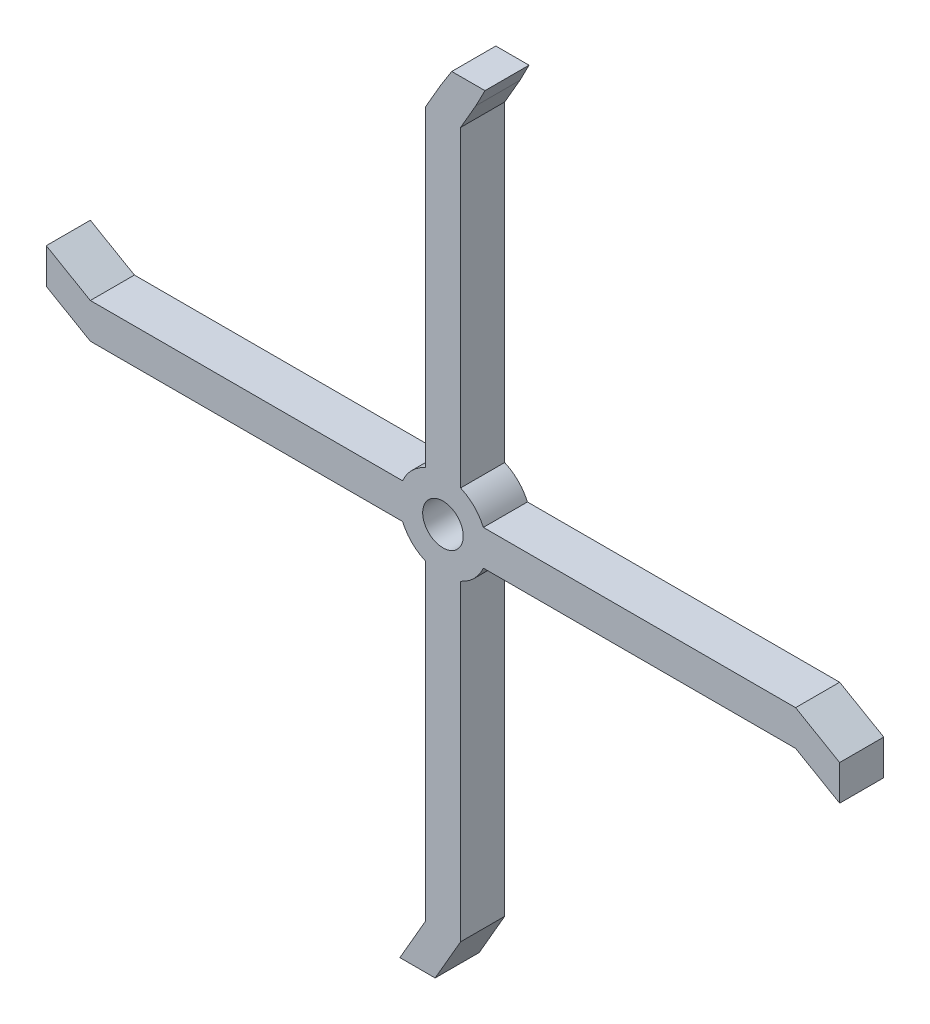
ISO-10303-21;
HEADER;
FILE_DESCRIPTION(('STEP AP214'),'2;1');
FILE_NAME('part.step','',(''),(''),'','','');
FILE_SCHEMA(('AUTOMOTIVE_DESIGN { 1 0 10303 214 1 1 1 1 }'));
ENDSEC;
DATA;
#1=APPLICATION_CONTEXT('core data for automotive mechanical design processes');
#2=APPLICATION_PROTOCOL_DEFINITION('international standard','automotive_design',2000,#1);
#3=PRODUCT_CONTEXT('',#1,'mechanical');
#4=PRODUCT('Part','Part','',(#3));
#5=PRODUCT_RELATED_PRODUCT_CATEGORY('part','',(#4));
#6=PRODUCT_DEFINITION_FORMATION('','',#4);
#7=PRODUCT_DEFINITION_CONTEXT('part definition',#1,'design');
#8=PRODUCT_DEFINITION('design','',#6,#7);
#9=PRODUCT_DEFINITION_SHAPE('','',#8);
#10=(LENGTH_UNIT() NAMED_UNIT(*) SI_UNIT(.MILLI.,.METRE.));
#11=(NAMED_UNIT(*) PLANE_ANGLE_UNIT() SI_UNIT($,.RADIAN.));
#12=(NAMED_UNIT(*) SI_UNIT($,.STERADIAN.) SOLID_ANGLE_UNIT());
#13=UNCERTAINTY_MEASURE_WITH_UNIT(LENGTH_MEASURE(1.E-05),#10,'distance_accuracy_value','');
#14=(GEOMETRIC_REPRESENTATION_CONTEXT(3) GLOBAL_UNCERTAINTY_ASSIGNED_CONTEXT((#13)) GLOBAL_UNIT_ASSIGNED_CONTEXT((#10,
#11,#12)) REPRESENTATION_CONTEXT('',''));
#15=CARTESIAN_POINT('',(0.,0.,0.));
#16=DIRECTION('',(0.,0.,1.));
#17=DIRECTION('',(1.,0.,0.));
#18=AXIS2_PLACEMENT_3D('',#15,#16,#17);
#19=CARTESIAN_POINT('',(0.,0.,5.));
#20=DIRECTION('',(0.,0.,-1.));
#21=DIRECTION('',(-1.,0.,0.));
#22=AXIS2_PLACEMENT_3D('',#19,#20,#21);
#23=CYLINDRICAL_SURFACE('',#22,5.);
#24=DIRECTION('',(0.,0.,-1.));
#25=VECTOR('',#24,1.);
#26=CARTESIAN_POINT('',(-2.,-4.58257569495584,5.));
#27=LINE('',#26,#25);
#28=CARTESIAN_POINT('',(-2.,-4.58257569495584,5.));
#29=VERTEX_POINT('',#28);
#30=CARTESIAN_POINT('',(-2.,-4.58257569495584,0.));
#31=VERTEX_POINT('',#30);
#32=EDGE_CURVE('E62',#29,#31,#27,.T.);
#33=ORIENTED_EDGE('',*,*,#32,.F.);
#34=CARTESIAN_POINT('',(0.,0.,5.));
#35=DIRECTION('',(0.,0.,1.));
#36=DIRECTION('',(1.,0.,0.));
#37=AXIS2_PLACEMENT_3D('',#34,#35,#36);
#38=CIRCLE('',#37,5.);
#39=CARTESIAN_POINT('',(-4.58257569495584,-2.,5.));
#40=VERTEX_POINT('',#39);
#41=EDGE_CURVE('E47',#40,#29,#38,.T.);
#42=ORIENTED_EDGE('',*,*,#41,.F.);
#43=DIRECTION('',(0.,0.,-1.));
#44=VECTOR('',#43,1.);
#45=CARTESIAN_POINT('',(-4.58257569495584,-2.,5.));
#46=LINE('',#45,#44);
#47=CARTESIAN_POINT('',(-4.58257569495584,-2.,0.));
#48=VERTEX_POINT('',#47);
#49=EDGE_CURVE('E298',#40,#48,#46,.T.);
#50=ORIENTED_EDGE('',*,*,#49,.T.);
#51=CARTESIAN_POINT('',(0.,0.,0.));
#52=DIRECTION('',(0.,0.,1.));
#53=DIRECTION('',(1.,0.,0.));
#54=AXIS2_PLACEMENT_3D('',#51,#52,#53);
#55=CIRCLE('',#54,5.);
#56=EDGE_CURVE('E450',#48,#31,#55,.T.);
#57=ORIENTED_EDGE('',*,*,#56,.T.);
#58=EDGE_LOOP('',(#33,#42,#50,#57));
#59=FACE_BOUND('',#58,.T.);
#60=ADVANCED_FACE('F38',(#59),#23,.T.);
#61=DIRECTION('',(0.,0.,-1.));
#62=VECTOR('',#61,1.);
#63=CARTESIAN_POINT('',(2.,-4.58257569495584,5.));
#64=LINE('',#63,#62);
#65=CARTESIAN_POINT('',(2.,-4.58257569495584,5.));
#66=VERTEX_POINT('',#65);
#67=CARTESIAN_POINT('',(2.,-4.58257569495584,0.));
#68=VERTEX_POINT('',#67);
#69=EDGE_CURVE('E447',#66,#68,#64,.T.);
#70=ORIENTED_EDGE('',*,*,#69,.T.);
#71=CARTESIAN_POINT('',(4.58257569495584,-2.,0.));
#72=VERTEX_POINT('',#71);
#73=EDGE_CURVE('E445',#68,#72,#55,.T.);
#74=ORIENTED_EDGE('',*,*,#73,.T.);
#75=DIRECTION('',(0.,0.,-1.));
#76=VECTOR('',#75,1.);
#77=CARTESIAN_POINT('',(4.58257569495584,-2.,5.));
#78=LINE('',#77,#76);
#79=CARTESIAN_POINT('',(4.58257569495584,-2.,5.));
#80=VERTEX_POINT('',#79);
#81=EDGE_CURVE('E276',#80,#72,#78,.T.);
#82=ORIENTED_EDGE('',*,*,#81,.F.);
#83=EDGE_CURVE('E48',#66,#80,#38,.T.);
#84=ORIENTED_EDGE('',*,*,#83,.F.);
#85=EDGE_LOOP('',(#70,#74,#82,#84));
#86=FACE_BOUND('',#85,.T.);
#87=ADVANCED_FACE('F409',(#86),#23,.T.);
#88=DIRECTION('',(0.,0.,-1.));
#89=VECTOR('',#88,1.);
#90=CARTESIAN_POINT('',(4.58257569495584,2.,5.));
#91=LINE('',#90,#89);
#92=CARTESIAN_POINT('',(4.58257569495584,2.,5.));
#93=VERTEX_POINT('',#92);
#94=CARTESIAN_POINT('',(4.58257569495584,2.,0.));
#95=VERTEX_POINT('',#94);
#96=EDGE_CURVE('E279',#93,#95,#91,.T.);
#97=ORIENTED_EDGE('',*,*,#96,.T.);
#98=CARTESIAN_POINT('',(2.,4.58257569495584,0.));
#99=VERTEX_POINT('',#98);
#100=EDGE_CURVE('E388',#95,#99,#55,.T.);
#101=ORIENTED_EDGE('',*,*,#100,.T.);
#102=DIRECTION('',(0.,0.,-1.));
#103=VECTOR('',#102,1.);
#104=CARTESIAN_POINT('',(2.,4.58257569495584,5.));
#105=LINE('',#104,#103);
#106=CARTESIAN_POINT('',(2.,4.58257569495584,5.));
#107=VERTEX_POINT('',#106);
#108=EDGE_CURVE('E376',#107,#99,#105,.T.);
#109=ORIENTED_EDGE('',*,*,#108,.F.);
#110=EDGE_CURVE('E422',#93,#107,#38,.T.);
#111=ORIENTED_EDGE('',*,*,#110,.F.);
#112=EDGE_LOOP('',(#97,#101,#109,#111));
#113=FACE_BOUND('',#112,.T.);
#114=ADVANCED_FACE('F40',(#113),#23,.T.);
#115=CARTESIAN_POINT('',(-1.99999999999999,4.58257569495584,0.));
#116=VERTEX_POINT('',#115);
#117=CARTESIAN_POINT('',(-4.58257569495584,2.,0.));
#118=VERTEX_POINT('',#117);
#119=EDGE_CURVE('E42',#116,#118,#55,.T.);
#120=ORIENTED_EDGE('',*,*,#119,.T.);
#121=DIRECTION('',(0.,0.,-1.));
#122=VECTOR('',#121,1.);
#123=CARTESIAN_POINT('',(-4.58257569495584,2.,5.));
#124=LINE('',#123,#122);
#125=CARTESIAN_POINT('',(-4.58257569495584,2.,5.));
#126=VERTEX_POINT('',#125);
#127=EDGE_CURVE('E322',#126,#118,#124,.T.);
#128=ORIENTED_EDGE('',*,*,#127,.F.);
#129=CARTESIAN_POINT('',(-1.99999999999999,4.58257569495584,5.));
#130=VERTEX_POINT('',#129);
#131=EDGE_CURVE('E11',#130,#126,#38,.T.);
#132=ORIENTED_EDGE('',*,*,#131,.F.);
#133=DIRECTION('',(0.,0.,-1.));
#134=VECTOR('',#133,1.);
#135=CARTESIAN_POINT('',(-1.99999999999999,4.58257569495584,5.));
#136=LINE('',#135,#134);
#137=EDGE_CURVE('E379',#130,#116,#136,.T.);
#138=ORIENTED_EDGE('',*,*,#137,.T.);
#139=EDGE_LOOP('',(#120,#128,#132,#138));
#140=FACE_BOUND('',#139,.T.);
#141=ADVANCED_FACE('F413',(#140),#23,.T.);
#142=CARTESIAN_POINT('',(0.,0.,5.));
#143=DIRECTION('',(0.,0.,1.));
#144=DIRECTION('',(1.,0.,0.));
#145=AXIS2_PLACEMENT_3D('',#142,#143,#144);
#146=PLANE('',#145);
#147=ORIENTED_EDGE('',*,*,#41,.T.);
#148=DIRECTION('',(0.,-1.,0.));
#149=VECTOR('',#148,1.);
#150=CARTESIAN_POINT('',(-2.,0.,5.));
#151=LINE('',#150,#149);
#152=CARTESIAN_POINT('',(-2.,-40.,5.));
#153=VERTEX_POINT('',#152);
#154=EDGE_CURVE('E224',#29,#153,#151,.T.);
#155=ORIENTED_EDGE('',*,*,#154,.T.);
#156=DIRECTION('',(-0.499999999999995,-0.866025403784442,0.));
#157=VECTOR('',#156,1.);
#158=CARTESIAN_POINT('',(15.8205080756886,-9.13397459621535,5.));
#159=LINE('',#158,#157);
#160=CARTESIAN_POINT('',(-4.88675134594808,-45.,5.));
#161=VERTEX_POINT('',#160);
#162=EDGE_CURVE('E213',#153,#161,#159,.T.);
#163=ORIENTED_EDGE('',*,*,#162,.T.);
#164=DIRECTION('',(1.,0.,0.));
#165=VECTOR('',#164,1.);
#166=CARTESIAN_POINT('',(0.,-45.,5.));
#167=LINE('',#166,#165);
#168=CARTESIAN_POINT('',(-0.886751345948087,-45.,5.));
#169=VERTEX_POINT('',#168);
#170=EDGE_CURVE('E223',#161,#169,#167,.T.);
#171=ORIENTED_EDGE('',*,*,#170,.T.);
#172=DIRECTION('',(0.499999999999996,0.866025403784441,0.));
#173=VECTOR('',#172,1.);
#174=CARTESIAN_POINT('',(18.8205080756887,-10.8660254037843,5.));
#175=LINE('',#174,#173);
#176=CARTESIAN_POINT('',(2.,-40.,5.));
#177=VERTEX_POINT('',#176);
#178=EDGE_CURVE('E454',#169,#177,#175,.T.);
#179=ORIENTED_EDGE('',*,*,#178,.T.);
#180=DIRECTION('',(0.,1.,0.));
#181=VECTOR('',#180,1.);
#182=CARTESIAN_POINT('',(2.,0.,5.));
#183=LINE('',#182,#181);
#184=EDGE_CURVE('E452',#177,#66,#183,.T.);
#185=ORIENTED_EDGE('',*,*,#184,.T.);
#186=ORIENTED_EDGE('',*,*,#83,.T.);
#187=DIRECTION('',(1.,0.,0.));
#188=VECTOR('',#187,1.);
#189=CARTESIAN_POINT('',(0.,-2.,5.));
#190=LINE('',#189,#188);
#191=CARTESIAN_POINT('',(40.,-2.,5.));
#192=VERTEX_POINT('',#191);
#193=EDGE_CURVE('E252',#80,#192,#190,.T.);
#194=ORIENTED_EDGE('',*,*,#193,.T.);
#195=DIRECTION('',(-0.866025403784442,0.499999999999995,0.));
#196=VECTOR('',#195,1.);
#197=CARTESIAN_POINT('',(9.13397459621536,15.8205080756886,5.));
#198=LINE('',#197,#196);
#199=CARTESIAN_POINT('',(45.,-4.88675134594809,5.));
#200=VERTEX_POINT('',#199);
#201=EDGE_CURVE('E254',#200,#192,#198,.T.);
#202=ORIENTED_EDGE('',*,*,#201,.F.);
#203=DIRECTION('',(0.,-1.,0.));
#204=VECTOR('',#203,1.);
#205=CARTESIAN_POINT('',(45.,0.,5.));
#206=LINE('',#205,#204);
#207=CARTESIAN_POINT('',(45.,-0.886751345948091,5.));
#208=VERTEX_POINT('',#207);
#209=EDGE_CURVE('E257',#208,#200,#206,.T.);
#210=ORIENTED_EDGE('',*,*,#209,.F.);
#211=DIRECTION('',(0.866025403784441,-0.499999999999995,0.));
#212=VECTOR('',#211,1.);
#213=CARTESIAN_POINT('',(10.8660254037842,18.8205080756887,5.));
#214=LINE('',#213,#212);
#215=CARTESIAN_POINT('',(40.,2.,5.));
#216=VERTEX_POINT('',#215);
#217=EDGE_CURVE('E245',#216,#208,#214,.T.);
#218=ORIENTED_EDGE('',*,*,#217,.F.);
#219=DIRECTION('',(-1.,0.,0.));
#220=VECTOR('',#219,1.);
#221=CARTESIAN_POINT('',(0.,2.,5.));
#222=LINE('',#221,#220);
#223=EDGE_CURVE('E248',#216,#93,#222,.T.);
#224=ORIENTED_EDGE('',*,*,#223,.T.);
#225=ORIENTED_EDGE('',*,*,#110,.T.);
#226=DIRECTION('',(0.,1.,0.));
#227=VECTOR('',#226,1.);
#228=CARTESIAN_POINT('',(2.00000000000001,0.,5.));
#229=LINE('',#228,#227);
#230=CARTESIAN_POINT('',(1.99999999999998,40.,5.));
#231=VERTEX_POINT('',#230);
#232=EDGE_CURVE('E333',#107,#231,#229,.T.);
#233=ORIENTED_EDGE('',*,*,#232,.T.);
#234=DIRECTION('',(-0.499999999999993,-0.866025403784443,0.));
#235=VECTOR('',#234,1.);
#236=CARTESIAN_POINT('',(-15.8205080756886,9.13397459621529,5.));
#237=LINE('',#236,#235);
#238=CARTESIAN_POINT('',(3.7282679058567,42.9934478220346,5.));
#239=VERTEX_POINT('',#238);
#240=EDGE_CURVE('E335',#239,#231,#237,.T.);
#241=ORIENTED_EDGE('',*,*,#240,.F.);
#242=DIRECTION('',(-0.459096275000418,-0.888386520767138,0.));
#243=VECTOR('',#242,1.);
#244=CARTESIAN_POINT('',(-14.5926270323289,7.54111026721517,5.));
#245=LINE('',#244,#243);
#246=CARTESIAN_POINT('',(4.76520465462956,45.,5.));
#247=VERTEX_POINT('',#246);
#248=EDGE_CURVE('E338',#247,#239,#245,.T.);
#249=ORIENTED_EDGE('',*,*,#248,.F.);
#250=DIRECTION('',(1.,0.,0.));
#251=VECTOR('',#250,1.);
#252=CARTESIAN_POINT('',(0.,45.,5.));
#253=LINE('',#252,#251);
#254=CARTESIAN_POINT('',(0.996826511950873,45.,5.));
#255=VERTEX_POINT('',#254);
#256=EDGE_CURVE('E341',#255,#247,#253,.T.);
#257=ORIENTED_EDGE('',*,*,#256,.F.);
#258=DIRECTION('',(0.534373108507071,0.845248709495904,0.));
#259=VECTOR('',#258,1.);
#260=CARTESIAN_POINT('',(-19.6133400189448,12.3997130742504,5.));
#261=LINE('',#260,#259);
#262=CARTESIAN_POINT('',(-0.271732094143301,42.9934478220346,5.));
#263=VERTEX_POINT('',#262);
#264=EDGE_CURVE('E344',#263,#255,#261,.T.);
#265=ORIENTED_EDGE('',*,*,#264,.F.);
#266=DIRECTION('',(0.499999999999992,0.866025403784443,0.));
#267=VECTOR('',#266,1.);
#268=CARTESIAN_POINT('',(-18.8205080756886,10.8660254037841,5.));
#269=LINE('',#268,#267);
#270=CARTESIAN_POINT('',(-2.00000000000001,40.,5.));
#271=VERTEX_POINT('',#270);
#272=EDGE_CURVE('E326',#271,#263,#269,.T.);
#273=ORIENTED_EDGE('',*,*,#272,.F.);
#274=DIRECTION('',(0.,-1.,0.));
#275=VECTOR('',#274,1.);
#276=CARTESIAN_POINT('',(-1.99999999999999,0.,5.));
#277=LINE('',#276,#275);
#278=EDGE_CURVE('E329',#271,#130,#277,.T.);
#279=ORIENTED_EDGE('',*,*,#278,.T.);
#280=ORIENTED_EDGE('',*,*,#131,.T.);
#281=DIRECTION('',(1.,0.,0.));
#282=VECTOR('',#281,1.);
#283=CARTESIAN_POINT('',(0.,2.,5.));
#284=LINE('',#283,#282);
#285=CARTESIAN_POINT('',(-40.,2.,5.));
#286=VERTEX_POINT('',#285);
#287=EDGE_CURVE('E285',#286,#126,#284,.T.);
#288=ORIENTED_EDGE('',*,*,#287,.F.);
#289=DIRECTION('',(-0.866025403784443,0.499999999999993,0.));
#290=VECTOR('',#289,1.);
#291=CARTESIAN_POINT('',(-9.1339745962153,-15.8205080756886,5.));
#292=LINE('',#291,#290);
#293=CARTESIAN_POINT('',(-45.,4.88675134594807,5.));
#294=VERTEX_POINT('',#293);
#295=EDGE_CURVE('E288',#286,#294,#292,.T.);
#296=ORIENTED_EDGE('',*,*,#295,.T.);
#297=DIRECTION('',(0.,-1.,0.));
#298=VECTOR('',#297,1.);
#299=CARTESIAN_POINT('',(-45.,0.,5.));
#300=LINE('',#299,#298);
#301=CARTESIAN_POINT('',(-45.,0.886751345948076,5.));
#302=VERTEX_POINT('',#301);
#303=EDGE_CURVE('E291',#294,#302,#300,.T.);
#304=ORIENTED_EDGE('',*,*,#303,.T.);
#305=DIRECTION('',(0.866025403784443,-0.499999999999993,0.));
#306=VECTOR('',#305,1.);
#307=CARTESIAN_POINT('',(-10.8660254037841,-18.8205080756886,5.));
#308=LINE('',#307,#306);
#309=CARTESIAN_POINT('',(-40.,-2.,5.));
#310=VERTEX_POINT('',#309);
#311=EDGE_CURVE('E293',#302,#310,#308,.T.);
#312=ORIENTED_EDGE('',*,*,#311,.T.);
#313=DIRECTION('',(-1.,0.,0.));
#314=VECTOR('',#313,1.);
#315=CARTESIAN_POINT('',(0.,-2.,5.));
#316=LINE('',#315,#314);
#317=EDGE_CURVE('E295',#40,#310,#316,.T.);
#318=ORIENTED_EDGE('',*,*,#317,.F.);
#319=EDGE_LOOP('',(#147,#155,#163,#171,#179,#185,#186,#194,#202,#210,#218,#224,#225,#233,#241,
#249,#257,#265,#273,#279,#280,#288,#296,#304,#312,#318));
#320=FACE_BOUND('',#319,.T.);
#321=CARTESIAN_POINT('',(0.,0.,5.));
#322=DIRECTION('',(0.,0.,1.));
#323=DIRECTION('',(1.,0.,0.));
#324=AXIS2_PLACEMENT_3D('',#321,#322,#323);
#325=CIRCLE('',#324,2.3);
#326=CARTESIAN_POINT('',(2.3,0.,5.));
#327=VERTEX_POINT('',#326);
#328=EDGE_CURVE('E385',#327,#327,#325,.T.);
#329=ORIENTED_EDGE('',*,*,#328,.F.);
#330=EDGE_LOOP('',(#329));
#331=FACE_BOUND('',#330,.T.);
#332=ADVANCED_FACE('F227',(#320,#331),#146,.T.);
#333=CARTESIAN_POINT('',(0.,0.,0.));
#334=DIRECTION('',(0.,0.,1.));
#335=DIRECTION('',(1.,0.,0.));
#336=AXIS2_PLACEMENT_3D('',#333,#334,#335);
#337=PLANE('',#336);
#338=ORIENTED_EDGE('',*,*,#73,.F.);
#339=DIRECTION('',(0.,1.,0.));
#340=VECTOR('',#339,1.);
#341=CARTESIAN_POINT('',(2.,0.,0.));
#342=LINE('',#341,#340);
#343=CARTESIAN_POINT('',(2.,-40.,0.));
#344=VERTEX_POINT('',#343);
#345=EDGE_CURVE('E231',#344,#68,#342,.T.);
#346=ORIENTED_EDGE('',*,*,#345,.F.);
#347=DIRECTION('',(0.499999999999996,0.866025403784441,0.));
#348=VECTOR('',#347,1.);
#349=CARTESIAN_POINT('',(18.8205080756887,-10.8660254037843,0.));
#350=LINE('',#349,#348);
#351=CARTESIAN_POINT('',(-0.886751345948087,-45.,0.));
#352=VERTEX_POINT('',#351);
#353=EDGE_CURVE('E470',#352,#344,#350,.T.);
#354=ORIENTED_EDGE('',*,*,#353,.F.);
#355=DIRECTION('',(1.,0.,0.));
#356=VECTOR('',#355,1.);
#357=CARTESIAN_POINT('',(0.,-45.,0.));
#358=LINE('',#357,#356);
#359=CARTESIAN_POINT('',(-4.88675134594808,-45.,0.));
#360=VERTEX_POINT('',#359);
#361=EDGE_CURVE('E473',#360,#352,#358,.T.);
#362=ORIENTED_EDGE('',*,*,#361,.F.);
#363=DIRECTION('',(-0.499999999999995,-0.866025403784442,0.));
#364=VECTOR('',#363,1.);
#365=CARTESIAN_POINT('',(15.8205080756886,-9.13397459621535,0.));
#366=LINE('',#365,#364);
#367=CARTESIAN_POINT('',(-2.,-40.,0.));
#368=VERTEX_POINT('',#367);
#369=EDGE_CURVE('E475',#368,#360,#366,.T.);
#370=ORIENTED_EDGE('',*,*,#369,.F.);
#371=DIRECTION('',(0.,-1.,0.));
#372=VECTOR('',#371,1.);
#373=CARTESIAN_POINT('',(-2.,0.,0.));
#374=LINE('',#373,#372);
#375=EDGE_CURVE('E235',#31,#368,#374,.T.);
#376=ORIENTED_EDGE('',*,*,#375,.F.);
#377=ORIENTED_EDGE('',*,*,#56,.F.);
#378=DIRECTION('',(-1.,0.,0.));
#379=VECTOR('',#378,1.);
#380=CARTESIAN_POINT('',(0.,-2.,0.));
#381=LINE('',#380,#379);
#382=CARTESIAN_POINT('',(-40.,-2.,0.));
#383=VERTEX_POINT('',#382);
#384=EDGE_CURVE('E289',#48,#383,#381,.T.);
#385=ORIENTED_EDGE('',*,*,#384,.T.);
#386=DIRECTION('',(0.866025403784443,-0.499999999999993,0.));
#387=VECTOR('',#386,1.);
#388=CARTESIAN_POINT('',(-10.8660254037841,-18.8205080756886,0.));
#389=LINE('',#388,#387);
#390=CARTESIAN_POINT('',(-45.,0.886751345948076,0.));
#391=VERTEX_POINT('',#390);
#392=EDGE_CURVE('E305',#391,#383,#389,.T.);
#393=ORIENTED_EDGE('',*,*,#392,.F.);
#394=DIRECTION('',(0.,-1.,0.));
#395=VECTOR('',#394,1.);
#396=CARTESIAN_POINT('',(-45.,0.,0.));
#397=LINE('',#396,#395);
#398=CARTESIAN_POINT('',(-45.,4.88675134594807,0.));
#399=VERTEX_POINT('',#398);
#400=EDGE_CURVE('E303',#399,#391,#397,.T.);
#401=ORIENTED_EDGE('',*,*,#400,.F.);
#402=DIRECTION('',(-0.866025403784443,0.499999999999993,0.));
#403=VECTOR('',#402,1.);
#404=CARTESIAN_POINT('',(-9.1339745962153,-15.8205080756886,0.));
#405=LINE('',#404,#403);
#406=CARTESIAN_POINT('',(-40.,2.,0.));
#407=VERTEX_POINT('',#406);
#408=EDGE_CURVE('E301',#407,#399,#405,.T.);
#409=ORIENTED_EDGE('',*,*,#408,.F.);
#410=DIRECTION('',(1.,0.,0.));
#411=VECTOR('',#410,1.);
#412=CARTESIAN_POINT('',(0.,2.,0.));
#413=LINE('',#412,#411);
#414=EDGE_CURVE('E284',#407,#118,#413,.T.);
#415=ORIENTED_EDGE('',*,*,#414,.T.);
#416=ORIENTED_EDGE('',*,*,#119,.F.);
#417=DIRECTION('',(0.,-1.,0.));
#418=VECTOR('',#417,1.);
#419=CARTESIAN_POINT('',(-1.99999999999999,0.,0.));
#420=LINE('',#419,#418);
#421=CARTESIAN_POINT('',(-2.00000000000001,40.,0.));
#422=VERTEX_POINT('',#421);
#423=EDGE_CURVE('E350',#422,#116,#420,.T.);
#424=ORIENTED_EDGE('',*,*,#423,.F.);
#425=DIRECTION('',(0.499999999999992,0.866025403784443,0.));
#426=VECTOR('',#425,1.);
#427=CARTESIAN_POINT('',(-18.8205080756886,10.8660254037841,0.));
#428=LINE('',#427,#426);
#429=CARTESIAN_POINT('',(-0.271732094143301,42.9934478220346,0.));
#430=VERTEX_POINT('',#429);
#431=EDGE_CURVE('E325',#422,#430,#428,.T.);
#432=ORIENTED_EDGE('',*,*,#431,.T.);
#433=DIRECTION('',(0.534373108507071,0.845248709495904,0.));
#434=VECTOR('',#433,1.);
#435=CARTESIAN_POINT('',(-19.6133400189448,12.3997130742504,0.));
#436=LINE('',#435,#434);
#437=CARTESIAN_POINT('',(0.996826511950873,45.,0.));
#438=VERTEX_POINT('',#437);
#439=EDGE_CURVE('E330',#430,#438,#436,.T.);
#440=ORIENTED_EDGE('',*,*,#439,.T.);
#441=DIRECTION('',(1.,0.,0.));
#442=VECTOR('',#441,1.);
#443=CARTESIAN_POINT('',(0.,45.,0.));
#444=LINE('',#443,#442);
#445=CARTESIAN_POINT('',(4.76520465462956,45.,0.));
#446=VERTEX_POINT('',#445);
#447=EDGE_CURVE('E362',#438,#446,#444,.T.);
#448=ORIENTED_EDGE('',*,*,#447,.T.);
#449=DIRECTION('',(-0.459096275000418,-0.888386520767138,0.));
#450=VECTOR('',#449,1.);
#451=CARTESIAN_POINT('',(-14.5926270323289,7.54111026721517,0.));
#452=LINE('',#451,#450);
#453=CARTESIAN_POINT('',(3.7282679058567,42.9934478220346,0.));
#454=VERTEX_POINT('',#453);
#455=EDGE_CURVE('E359',#446,#454,#452,.T.);
#456=ORIENTED_EDGE('',*,*,#455,.T.);
#457=DIRECTION('',(-0.499999999999993,-0.866025403784443,0.));
#458=VECTOR('',#457,1.);
#459=CARTESIAN_POINT('',(-15.8205080756886,9.13397459621529,0.));
#460=LINE('',#459,#458);
#461=CARTESIAN_POINT('',(1.99999999999998,40.,0.));
#462=VERTEX_POINT('',#461);
#463=EDGE_CURVE('E356',#454,#462,#460,.T.);
#464=ORIENTED_EDGE('',*,*,#463,.T.);
#465=DIRECTION('',(0.,1.,0.));
#466=VECTOR('',#465,1.);
#467=CARTESIAN_POINT('',(2.00000000000001,0.,0.));
#468=LINE('',#467,#466);
#469=EDGE_CURVE('E353',#99,#462,#468,.T.);
#470=ORIENTED_EDGE('',*,*,#469,.F.);
#471=ORIENTED_EDGE('',*,*,#100,.F.);
#472=DIRECTION('',(-1.,0.,0.));
#473=VECTOR('',#472,1.);
#474=CARTESIAN_POINT('',(0.,2.,0.));
#475=LINE('',#474,#473);
#476=CARTESIAN_POINT('',(40.,2.,0.));
#477=VERTEX_POINT('',#476);
#478=EDGE_CURVE('E239',#477,#95,#475,.T.);
#479=ORIENTED_EDGE('',*,*,#478,.F.);
#480=DIRECTION('',(0.866025403784441,-0.499999999999995,0.));
#481=VECTOR('',#480,1.);
#482=CARTESIAN_POINT('',(10.8660254037842,18.8205080756887,0.));
#483=LINE('',#482,#481);
#484=CARTESIAN_POINT('',(45.,-0.886751345948091,0.));
#485=VERTEX_POINT('',#484);
#486=EDGE_CURVE('E236',#477,#485,#483,.T.);
#487=ORIENTED_EDGE('',*,*,#486,.T.);
#488=DIRECTION('',(0.,-1.,0.));
#489=VECTOR('',#488,1.);
#490=CARTESIAN_POINT('',(45.,0.,0.));
#491=LINE('',#490,#489);
#492=CARTESIAN_POINT('',(45.,-4.88675134594809,0.));
#493=VERTEX_POINT('',#492);
#494=EDGE_CURVE('E249',#485,#493,#491,.T.);
#495=ORIENTED_EDGE('',*,*,#494,.T.);
#496=DIRECTION('',(-0.866025403784442,0.499999999999995,0.));
#497=VECTOR('',#496,1.);
#498=CARTESIAN_POINT('',(9.13397459621536,15.8205080756886,0.));
#499=LINE('',#498,#497);
#500=CARTESIAN_POINT('',(40.,-2.,0.));
#501=VERTEX_POINT('',#500);
#502=EDGE_CURVE('E266',#493,#501,#499,.T.);
#503=ORIENTED_EDGE('',*,*,#502,.T.);
#504=DIRECTION('',(1.,0.,0.));
#505=VECTOR('',#504,1.);
#506=CARTESIAN_POINT('',(0.,-2.,0.));
#507=LINE('',#506,#505);
#508=EDGE_CURVE('E263',#72,#501,#507,.T.);
#509=ORIENTED_EDGE('',*,*,#508,.F.);
#510=EDGE_LOOP('',(#338,#346,#354,#362,#370,#376,#377,#385,#393,#401,#409,#415,#416,#424,#432,
#440,#448,#456,#464,#470,#471,#479,#487,#495,#503,#509));
#511=FACE_BOUND('',#510,.T.);
#512=CARTESIAN_POINT('',(0.,0.,0.));
#513=DIRECTION('',(0.,0.,1.));
#514=DIRECTION('',(1.,0.,0.));
#515=AXIS2_PLACEMENT_3D('',#512,#513,#514);
#516=CIRCLE('',#515,2.3);
#517=CARTESIAN_POINT('',(2.3,0.,0.));
#518=VERTEX_POINT('',#517);
#519=EDGE_CURVE('E384',#518,#518,#516,.T.);
#520=ORIENTED_EDGE('',*,*,#519,.T.);
#521=EDGE_LOOP('',(#520));
#522=FACE_BOUND('',#521,.T.);
#523=ADVANCED_FACE('F392',(#511,#522),#337,.F.);
#524=CARTESIAN_POINT('',(0.,0.,5.));
#525=DIRECTION('',(0.,0.,-1.));
#526=DIRECTION('',(-1.,0.,0.));
#527=AXIS2_PLACEMENT_3D('',#524,#525,#526);
#528=CYLINDRICAL_SURFACE('',#527,2.3);
#529=ORIENTED_EDGE('',*,*,#328,.T.);
#530=EDGE_LOOP('',(#529));
#531=FACE_BOUND('',#530,.T.);
#532=ORIENTED_EDGE('',*,*,#519,.F.);
#533=EDGE_LOOP('',(#532));
#534=FACE_BOUND('',#533,.T.);
#535=ADVANCED_FACE('F394',(#531,#534),#528,.F.);
#536=CARTESIAN_POINT('',(-18.8205080756886,10.8660254037841,5.));
#537=DIRECTION('',(-0.866025403784443,0.499999999999992,0.));
#538=DIRECTION('',(-0.499999999999992,-0.866025403784443,0.));
#539=AXIS2_PLACEMENT_3D('',#536,#537,#538);
#540=PLANE('',#539);
#541=ORIENTED_EDGE('',*,*,#431,.F.);
#542=DIRECTION('',(0.,0.,-1.));
#543=VECTOR('',#542,1.);
#544=CARTESIAN_POINT('',(-2.00000000000001,40.,5.));
#545=LINE('',#544,#543);
#546=EDGE_CURVE('E382',#271,#422,#545,.T.);
#547=ORIENTED_EDGE('',*,*,#546,.F.);
#548=ORIENTED_EDGE('',*,*,#272,.T.);
#549=DIRECTION('',(0.,0.,-1.));
#550=VECTOR('',#549,1.);
#551=CARTESIAN_POINT('',(-0.271732094143301,42.9934478220346,5.));
#552=LINE('',#551,#550);
#553=EDGE_CURVE('E347',#263,#430,#552,.T.);
#554=ORIENTED_EDGE('',*,*,#553,.T.);
#555=EDGE_LOOP('',(#541,#547,#548,#554));
#556=FACE_BOUND('',#555,.T.);
#557=ADVANCED_FACE('F396',(#556),#540,.T.);
#558=CARTESIAN_POINT('',(-1.99999999999999,0.,5.));
#559=DIRECTION('',(1.,0.,0.));
#560=DIRECTION('',(0.,1.,0.));
#561=AXIS2_PLACEMENT_3D('',#558,#559,#560);
#562=PLANE('',#561);
#563=ORIENTED_EDGE('',*,*,#423,.T.);
#564=ORIENTED_EDGE('',*,*,#137,.F.);
#565=ORIENTED_EDGE('',*,*,#278,.F.);
#566=ORIENTED_EDGE('',*,*,#546,.T.);
#567=EDGE_LOOP('',(#563,#564,#565,#566));
#568=FACE_BOUND('',#567,.T.);
#569=ADVANCED_FACE('F403',(#568),#562,.F.);
#570=CARTESIAN_POINT('',(2.00000000000001,0.,5.));
#571=DIRECTION('',(-1.,0.,0.));
#572=DIRECTION('',(0.,-1.,0.));
#573=AXIS2_PLACEMENT_3D('',#570,#571,#572);
#574=PLANE('',#573);
#575=ORIENTED_EDGE('',*,*,#469,.T.);
#576=DIRECTION('',(0.,0.,-1.));
#577=VECTOR('',#576,1.);
#578=CARTESIAN_POINT('',(1.99999999999998,40.,5.));
#579=LINE('',#578,#577);
#580=EDGE_CURVE('E374',#231,#462,#579,.T.);
#581=ORIENTED_EDGE('',*,*,#580,.F.);
#582=ORIENTED_EDGE('',*,*,#232,.F.);
#583=ORIENTED_EDGE('',*,*,#108,.T.);
#584=EDGE_LOOP('',(#575,#581,#582,#583));
#585=FACE_BOUND('',#584,.T.);
#586=ADVANCED_FACE('F539',(#585),#574,.F.);
#587=CARTESIAN_POINT('',(-15.8205080756886,9.13397459621529,5.));
#588=DIRECTION('',(0.866025403784443,-0.499999999999993,0.));
#589=DIRECTION('',(0.499999999999993,0.866025403784443,0.));
#590=AXIS2_PLACEMENT_3D('',#587,#588,#589);
#591=PLANE('',#590);
#592=ORIENTED_EDGE('',*,*,#463,.F.);
#593=DIRECTION('',(0.,0.,-1.));
#594=VECTOR('',#593,1.);
#595=CARTESIAN_POINT('',(3.7282679058567,42.9934478220346,5.));
#596=LINE('',#595,#594);
#597=EDGE_CURVE('E372',#239,#454,#596,.T.);
#598=ORIENTED_EDGE('',*,*,#597,.F.);
#599=ORIENTED_EDGE('',*,*,#240,.T.);
#600=ORIENTED_EDGE('',*,*,#580,.T.);
#601=EDGE_LOOP('',(#592,#598,#599,#600));
#602=FACE_BOUND('',#601,.T.);
#603=ADVANCED_FACE('F535',(#602),#591,.T.);
#604=CARTESIAN_POINT('',(-14.5926270323289,7.54111026721517,5.));
#605=DIRECTION('',(0.888386520767138,-0.459096275000418,0.));
#606=DIRECTION('',(0.459096275000418,0.888386520767138,0.));
#607=AXIS2_PLACEMENT_3D('',#604,#605,#606);
#608=PLANE('',#607);
#609=ORIENTED_EDGE('',*,*,#455,.F.);
#610=DIRECTION('',(0.,0.,-1.));
#611=VECTOR('',#610,1.);
#612=CARTESIAN_POINT('',(4.76520465462956,45.,5.));
#613=LINE('',#612,#611);
#614=EDGE_CURVE('E370',#247,#446,#613,.T.);
#615=ORIENTED_EDGE('',*,*,#614,.F.);
#616=ORIENTED_EDGE('',*,*,#248,.T.);
#617=ORIENTED_EDGE('',*,*,#597,.T.);
#618=EDGE_LOOP('',(#609,#615,#616,#617));
#619=FACE_BOUND('',#618,.T.);
#620=ADVANCED_FACE('F531',(#619),#608,.T.);
#621=CARTESIAN_POINT('',(0.,45.,5.));
#622=DIRECTION('',(0.,1.,0.));
#623=DIRECTION('',(0.,0.,1.));
#624=AXIS2_PLACEMENT_3D('',#621,#622,#623);
#625=PLANE('',#624);
#626=ORIENTED_EDGE('',*,*,#447,.F.);
#627=DIRECTION('',(0.,0.,-1.));
#628=VECTOR('',#627,1.);
#629=CARTESIAN_POINT('',(0.996826511950873,45.,5.));
#630=LINE('',#629,#628);
#631=EDGE_CURVE('E368',#255,#438,#630,.T.);
#632=ORIENTED_EDGE('',*,*,#631,.F.);
#633=ORIENTED_EDGE('',*,*,#256,.T.);
#634=ORIENTED_EDGE('',*,*,#614,.T.);
#635=EDGE_LOOP('',(#626,#632,#633,#634));
#636=FACE_BOUND('',#635,.T.);
#637=ADVANCED_FACE('F527',(#636),#625,.T.);
#638=CARTESIAN_POINT('',(-19.6133400189448,12.3997130742504,5.));
#639=DIRECTION('',(-0.845248709495904,0.534373108507071,0.));
#640=DIRECTION('',(-0.534373108507071,-0.845248709495904,0.));
#641=AXIS2_PLACEMENT_3D('',#638,#639,#640);
#642=PLANE('',#641);
#643=ORIENTED_EDGE('',*,*,#439,.F.);
#644=ORIENTED_EDGE('',*,*,#553,.F.);
#645=ORIENTED_EDGE('',*,*,#264,.T.);
#646=ORIENTED_EDGE('',*,*,#631,.T.);
#647=EDGE_LOOP('',(#643,#644,#645,#646));
#648=FACE_BOUND('',#647,.T.);
#649=ADVANCED_FACE('F523',(#648),#642,.T.);
#650=CARTESIAN_POINT('',(0.,2.,5.));
#651=DIRECTION('',(0.,1.,0.));
#652=DIRECTION('',(0.,0.,1.));
#653=AXIS2_PLACEMENT_3D('',#650,#651,#652);
#654=PLANE('',#653);
#655=ORIENTED_EDGE('',*,*,#414,.F.);
#656=DIRECTION('',(0.,0.,-1.));
#657=VECTOR('',#656,1.);
#658=CARTESIAN_POINT('',(-40.,2.,5.));
#659=LINE('',#658,#657);
#660=EDGE_CURVE('E320',#286,#407,#659,.T.);
#661=ORIENTED_EDGE('',*,*,#660,.F.);
#662=ORIENTED_EDGE('',*,*,#287,.T.);
#663=ORIENTED_EDGE('',*,*,#127,.T.);
#664=EDGE_LOOP('',(#655,#661,#662,#663));
#665=FACE_BOUND('',#664,.T.);
#666=ADVANCED_FACE('F519',(#665),#654,.T.);
#667=CARTESIAN_POINT('',(-9.1339745962153,-15.8205080756886,5.));
#668=DIRECTION('',(-0.499999999999993,-0.866025403784442,0.));
#669=DIRECTION('',(0.866025403784442,-0.499999999999993,0.));
#670=AXIS2_PLACEMENT_3D('',#667,#668,#669);
#671=PLANE('',#670);
#672=ORIENTED_EDGE('',*,*,#408,.T.);
#673=DIRECTION('',(0.,0.,-1.));
#674=VECTOR('',#673,1.);
#675=CARTESIAN_POINT('',(-45.,4.88675134594807,5.));
#676=LINE('',#675,#674);
#677=EDGE_CURVE('E317',#294,#399,#676,.T.);
#678=ORIENTED_EDGE('',*,*,#677,.F.);
#679=ORIENTED_EDGE('',*,*,#295,.F.);
#680=ORIENTED_EDGE('',*,*,#660,.T.);
#681=EDGE_LOOP('',(#672,#678,#679,#680));
#682=FACE_BOUND('',#681,.T.);
#683=ADVANCED_FACE('F515',(#682),#671,.F.);
#684=CARTESIAN_POINT('',(-45.,0.,5.));
#685=DIRECTION('',(1.,0.,0.));
#686=DIRECTION('',(0.,1.,0.));
#687=AXIS2_PLACEMENT_3D('',#684,#685,#686);
#688=PLANE('',#687);
#689=ORIENTED_EDGE('',*,*,#400,.T.);
#690=DIRECTION('',(0.,0.,-1.));
#691=VECTOR('',#690,1.);
#692=CARTESIAN_POINT('',(-45.,0.886751345948076,5.));
#693=LINE('',#692,#691);
#694=EDGE_CURVE('E314',#302,#391,#693,.T.);
#695=ORIENTED_EDGE('',*,*,#694,.F.);
#696=ORIENTED_EDGE('',*,*,#303,.F.);
#697=ORIENTED_EDGE('',*,*,#677,.T.);
#698=EDGE_LOOP('',(#689,#695,#696,#697));
#699=FACE_BOUND('',#698,.T.);
#700=ADVANCED_FACE('F511',(#699),#688,.F.);
#701=CARTESIAN_POINT('',(-10.8660254037841,-18.8205080756886,5.));
#702=DIRECTION('',(0.499999999999993,0.866025403784443,0.));
#703=DIRECTION('',(-0.866025403784443,0.499999999999993,0.));
#704=AXIS2_PLACEMENT_3D('',#701,#702,#703);
#705=PLANE('',#704);
#706=ORIENTED_EDGE('',*,*,#392,.T.);
#707=DIRECTION('',(0.,0.,-1.));
#708=VECTOR('',#707,1.);
#709=CARTESIAN_POINT('',(-40.,-2.,5.));
#710=LINE('',#709,#708);
#711=EDGE_CURVE('E312',#310,#383,#710,.T.);
#712=ORIENTED_EDGE('',*,*,#711,.F.);
#713=ORIENTED_EDGE('',*,*,#311,.F.);
#714=ORIENTED_EDGE('',*,*,#694,.T.);
#715=EDGE_LOOP('',(#706,#712,#713,#714));
#716=FACE_BOUND('',#715,.T.);
#717=ADVANCED_FACE('F507',(#716),#705,.F.);
#718=CARTESIAN_POINT('',(0.,-2.,5.));
#719=DIRECTION('',(0.,-1.,0.));
#720=DIRECTION('',(0.,0.,-1.));
#721=AXIS2_PLACEMENT_3D('',#718,#719,#720);
#722=PLANE('',#721);
#723=ORIENTED_EDGE('',*,*,#384,.F.);
#724=ORIENTED_EDGE('',*,*,#49,.F.);
#725=ORIENTED_EDGE('',*,*,#317,.T.);
#726=ORIENTED_EDGE('',*,*,#711,.T.);
#727=EDGE_LOOP('',(#723,#724,#725,#726));
#728=FACE_BOUND('',#727,.T.);
#729=ADVANCED_FACE('F504',(#728),#722,.T.);
#730=CARTESIAN_POINT('',(10.8660254037842,18.8205080756887,5.));
#731=DIRECTION('',(0.499999999999995,0.866025403784441,0.));
#732=DIRECTION('',(-0.866025403784441,0.499999999999995,0.));
#733=AXIS2_PLACEMENT_3D('',#730,#731,#732);
#734=PLANE('',#733);
#735=ORIENTED_EDGE('',*,*,#486,.F.);
#736=DIRECTION('',(0.,0.,-1.));
#737=VECTOR('',#736,1.);
#738=CARTESIAN_POINT('',(40.,2.,5.));
#739=LINE('',#738,#737);
#740=EDGE_CURVE('E282',#216,#477,#739,.T.);
#741=ORIENTED_EDGE('',*,*,#740,.F.);
#742=ORIENTED_EDGE('',*,*,#217,.T.);
#743=DIRECTION('',(0.,0.,-1.));
#744=VECTOR('',#743,1.);
#745=CARTESIAN_POINT('',(45.,-0.886751345948091,5.));
#746=LINE('',#745,#744);
#747=EDGE_CURVE('E259',#208,#485,#746,.T.);
#748=ORIENTED_EDGE('',*,*,#747,.T.);
#749=EDGE_LOOP('',(#735,#741,#742,#748));
#750=FACE_BOUND('',#749,.T.);
#751=ADVANCED_FACE('F431',(#750),#734,.T.);
#752=CARTESIAN_POINT('',(0.,2.,5.));
#753=DIRECTION('',(0.,-1.,0.));
#754=DIRECTION('',(0.,0.,-1.));
#755=AXIS2_PLACEMENT_3D('',#752,#753,#754);
#756=PLANE('',#755);
#757=ORIENTED_EDGE('',*,*,#478,.T.);
#758=ORIENTED_EDGE('',*,*,#96,.F.);
#759=ORIENTED_EDGE('',*,*,#223,.F.);
#760=ORIENTED_EDGE('',*,*,#740,.T.);
#761=EDGE_LOOP('',(#757,#758,#759,#760));
#762=FACE_BOUND('',#761,.T.);
#763=ADVANCED_FACE('F426',(#762),#756,.F.);
#764=CARTESIAN_POINT('',(0.,-2.,5.));
#765=DIRECTION('',(0.,1.,0.));
#766=DIRECTION('',(0.,0.,1.));
#767=AXIS2_PLACEMENT_3D('',#764,#765,#766);
#768=PLANE('',#767);
#769=ORIENTED_EDGE('',*,*,#508,.T.);
#770=DIRECTION('',(0.,0.,-1.));
#771=VECTOR('',#770,1.);
#772=CARTESIAN_POINT('',(40.,-2.,5.));
#773=LINE('',#772,#771);
#774=EDGE_CURVE('E274',#192,#501,#773,.T.);
#775=ORIENTED_EDGE('',*,*,#774,.F.);
#776=ORIENTED_EDGE('',*,*,#193,.F.);
#777=ORIENTED_EDGE('',*,*,#81,.T.);
#778=EDGE_LOOP('',(#769,#775,#776,#777));
#779=FACE_BOUND('',#778,.T.);
#780=ADVANCED_FACE('F444',(#779),#768,.F.);
#781=CARTESIAN_POINT('',(9.13397459621536,15.8205080756886,5.));
#782=DIRECTION('',(-0.499999999999995,-0.866025403784442,0.));
#783=DIRECTION('',(0.866025403784442,-0.499999999999995,0.));
#784=AXIS2_PLACEMENT_3D('',#781,#782,#783);
#785=PLANE('',#784);
#786=ORIENTED_EDGE('',*,*,#502,.F.);
#787=DIRECTION('',(0.,0.,-1.));
#788=VECTOR('',#787,1.);
#789=CARTESIAN_POINT('',(45.,-4.88675134594809,5.));
#790=LINE('',#789,#788);
#791=EDGE_CURVE('E272',#200,#493,#790,.T.);
#792=ORIENTED_EDGE('',*,*,#791,.F.);
#793=ORIENTED_EDGE('',*,*,#201,.T.);
#794=ORIENTED_EDGE('',*,*,#774,.T.);
#795=EDGE_LOOP('',(#786,#792,#793,#794));
#796=FACE_BOUND('',#795,.T.);
#797=ADVANCED_FACE('F439',(#796),#785,.T.);
#798=CARTESIAN_POINT('',(45.,0.,5.));
#799=DIRECTION('',(1.,0.,0.));
#800=DIRECTION('',(0.,1.,0.));
#801=AXIS2_PLACEMENT_3D('',#798,#799,#800);
#802=PLANE('',#801);
#803=ORIENTED_EDGE('',*,*,#494,.F.);
#804=ORIENTED_EDGE('',*,*,#747,.F.);
#805=ORIENTED_EDGE('',*,*,#209,.T.);
#806=ORIENTED_EDGE('',*,*,#791,.T.);
#807=EDGE_LOOP('',(#803,#804,#805,#806));
#808=FACE_BOUND('',#807,.T.);
#809=ADVANCED_FACE('F435',(#808),#802,.T.);
#810=CARTESIAN_POINT('',(-2.,0.,5.));
#811=DIRECTION('',(1.,0.,0.));
#812=DIRECTION('',(0.,1.,0.));
#813=AXIS2_PLACEMENT_3D('',#810,#811,#812);
#814=PLANE('',#813);
#815=ORIENTED_EDGE('',*,*,#375,.T.);
#816=DIRECTION('',(0.,0.,-1.));
#817=VECTOR('',#816,1.);
#818=CARTESIAN_POINT('',(-2.,-40.,5.));
#819=LINE('',#818,#817);
#820=EDGE_CURVE('E217',#153,#368,#819,.T.);
#821=ORIENTED_EDGE('',*,*,#820,.F.);
#822=ORIENTED_EDGE('',*,*,#154,.F.);
#823=ORIENTED_EDGE('',*,*,#32,.T.);
#824=EDGE_LOOP('',(#815,#821,#822,#823));
#825=FACE_BOUND('',#824,.T.);
#826=ADVANCED_FACE('F233',(#825),#814,.F.);
#827=CARTESIAN_POINT('',(15.8205080756886,-9.13397459621535,5.));
#828=DIRECTION('',(0.866025403784442,-0.499999999999995,0.));
#829=DIRECTION('',(0.499999999999995,0.866025403784442,0.));
#830=AXIS2_PLACEMENT_3D('',#827,#828,#829);
#831=PLANE('',#830);
#832=ORIENTED_EDGE('',*,*,#369,.T.);
#833=DIRECTION('',(0.,0.,-1.));
#834=VECTOR('',#833,1.);
#835=CARTESIAN_POINT('',(-4.88675134594808,-45.,5.));
#836=LINE('',#835,#834);
#837=EDGE_CURVE('E220',#161,#360,#836,.T.);
#838=ORIENTED_EDGE('',*,*,#837,.F.);
#839=ORIENTED_EDGE('',*,*,#162,.F.);
#840=ORIENTED_EDGE('',*,*,#820,.T.);
#841=EDGE_LOOP('',(#832,#838,#839,#840));
#842=FACE_BOUND('',#841,.T.);
#843=ADVANCED_FACE('F215',(#842),#831,.F.);
#844=CARTESIAN_POINT('',(0.,-45.,5.));
#845=DIRECTION('',(0.,1.,0.));
#846=DIRECTION('',(0.,0.,1.));
#847=AXIS2_PLACEMENT_3D('',#844,#845,#846);
#848=PLANE('',#847);
#849=ORIENTED_EDGE('',*,*,#361,.T.);
#850=DIRECTION('',(0.,0.,-1.));
#851=VECTOR('',#850,1.);
#852=CARTESIAN_POINT('',(-0.886751345948087,-45.,5.));
#853=LINE('',#852,#851);
#854=EDGE_CURVE('E241',#169,#352,#853,.T.);
#855=ORIENTED_EDGE('',*,*,#854,.F.);
#856=ORIENTED_EDGE('',*,*,#170,.F.);
#857=ORIENTED_EDGE('',*,*,#837,.T.);
#858=EDGE_LOOP('',(#849,#855,#856,#857));
#859=FACE_BOUND('',#858,.T.);
#860=ADVANCED_FACE('F481',(#859),#848,.F.);
#861=CARTESIAN_POINT('',(18.8205080756887,-10.8660254037843,5.));
#862=DIRECTION('',(-0.866025403784441,0.499999999999996,0.));
#863=DIRECTION('',(-0.499999999999996,-0.866025403784441,0.));
#864=AXIS2_PLACEMENT_3D('',#861,#862,#863);
#865=PLANE('',#864);
#866=ORIENTED_EDGE('',*,*,#353,.T.);
#867=DIRECTION('',(0.,0.,-1.));
#868=VECTOR('',#867,1.);
#869=CARTESIAN_POINT('',(2.,-40.,5.));
#870=LINE('',#869,#868);
#871=EDGE_CURVE('E460',#177,#344,#870,.T.);
#872=ORIENTED_EDGE('',*,*,#871,.F.);
#873=ORIENTED_EDGE('',*,*,#178,.F.);
#874=ORIENTED_EDGE('',*,*,#854,.T.);
#875=EDGE_LOOP('',(#866,#872,#873,#874));
#876=FACE_BOUND('',#875,.T.);
#877=ADVANCED_FACE('F469',(#876),#865,.F.);
#878=CARTESIAN_POINT('',(2.,0.,5.));
#879=DIRECTION('',(-1.,0.,0.));
#880=DIRECTION('',(0.,-1.,0.));
#881=AXIS2_PLACEMENT_3D('',#878,#879,#880);
#882=PLANE('',#881);
#883=ORIENTED_EDGE('',*,*,#345,.T.);
#884=ORIENTED_EDGE('',*,*,#69,.F.);
#885=ORIENTED_EDGE('',*,*,#184,.F.);
#886=ORIENTED_EDGE('',*,*,#871,.T.);
#887=EDGE_LOOP('',(#883,#884,#885,#886));
#888=FACE_BOUND('',#887,.T.);
#889=ADVANCED_FACE('F459',(#888),#882,.F.);
#890=CLOSED_SHELL('',(#60,#87,#114,#141,#332,#523,#535,#557,#569,#586,#603,#620,#637,#649,#666,
#683,#700,#717,#729,#751,#763,#780,#797,#809,#826,#843,#860,#877,#889));
#891=MANIFOLD_SOLID_BREP('B2',#890);
#892=ADVANCED_BREP_SHAPE_REPRESENTATION('',(#18,#891),#14);
#893=SHAPE_DEFINITION_REPRESENTATION(#9,#892);
ENDSEC;
END-ISO-10303-21;
